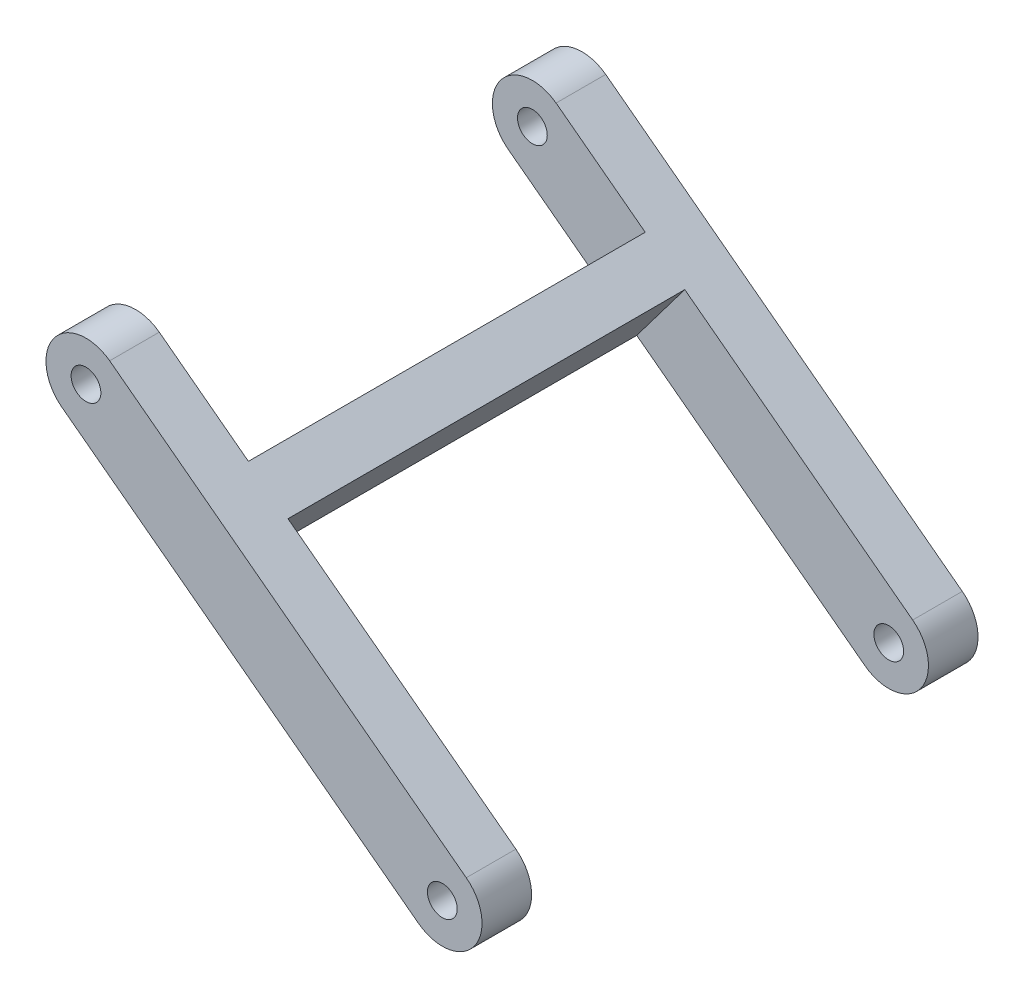
ISO-10303-21;
HEADER;
FILE_DESCRIPTION(('STEP AP214'),'2;1');
FILE_NAME('part.step','',(''),(''),'','','');
FILE_SCHEMA(('AUTOMOTIVE_DESIGN { 1 0 10303 214 1 1 1 1 }'));
ENDSEC;
DATA;
#1=APPLICATION_CONTEXT('core data for automotive mechanical design processes');
#2=APPLICATION_PROTOCOL_DEFINITION('international standard','automotive_design',2000,#1);
#3=PRODUCT_CONTEXT('',#1,'mechanical');
#4=PRODUCT('Part','Part','',(#3));
#5=PRODUCT_RELATED_PRODUCT_CATEGORY('part','',(#4));
#6=PRODUCT_DEFINITION_FORMATION('','',#4);
#7=PRODUCT_DEFINITION_CONTEXT('part definition',#1,'design');
#8=PRODUCT_DEFINITION('design','',#6,#7);
#9=PRODUCT_DEFINITION_SHAPE('','',#8);
#10=(LENGTH_UNIT() NAMED_UNIT(*) SI_UNIT(.MILLI.,.METRE.));
#11=(NAMED_UNIT(*) PLANE_ANGLE_UNIT() SI_UNIT($,.RADIAN.));
#12=(NAMED_UNIT(*) SI_UNIT($,.STERADIAN.) SOLID_ANGLE_UNIT());
#13=UNCERTAINTY_MEASURE_WITH_UNIT(LENGTH_MEASURE(1.E-05),#10,'distance_accuracy_value','');
#14=(GEOMETRIC_REPRESENTATION_CONTEXT(3) GLOBAL_UNCERTAINTY_ASSIGNED_CONTEXT((#13)) GLOBAL_UNIT_ASSIGNED_CONTEXT((#10,
#11,#12)) REPRESENTATION_CONTEXT('',''));
#15=CARTESIAN_POINT('',(0.,0.,0.));
#16=DIRECTION('',(0.,0.,1.));
#17=DIRECTION('',(1.,0.,0.));
#18=AXIS2_PLACEMENT_3D('',#15,#16,#17);
#19=CARTESIAN_POINT('',(-35.92301936865,27.1023371582526,0.));
#20=DIRECTION('',(0.,0.,1.));
#21=DIRECTION('',(1.,0.,0.));
#22=AXIS2_PLACEMENT_3D('',#19,#20,#21);
#23=PLANE('',#22);
#24=CARTESIAN_POINT('',(-35.92301936865,27.1023371582526,0.));
#25=DIRECTION('',(0.,0.,1.));
#26=DIRECTION('',(1.,0.,0.));
#27=AXIS2_PLACEMENT_3D('',#24,#25,#26);
#28=CIRCLE('',#27,1.5);
#29=CARTESIAN_POINT('',(-34.42301936865,27.1023371582526,0.));
#30=VERTEX_POINT('',#29);
#31=EDGE_CURVE('E298',#30,#30,#28,.T.);
#32=ORIENTED_EDGE('',*,*,#31,.T.);
#33=EDGE_LOOP('',(#32));
#34=FACE_BOUND('',#33,.T.);
#35=DIRECTION('',(0.602274159072283,0.79828931930333,0.));
#36=VECTOR('',#35,1.);
#37=CARTESIAN_POINT('',(-24.5499860236757,23.5630361486282,0.));
#38=LINE('',#37,#36);
#39=CARTESIAN_POINT('',(-29.3974472910294,17.1379280858387,0.));
#40=VERTEX_POINT('',#39);
#41=CARTESIAN_POINT('',(-24.5499860236757,23.5630361486282,0.));
#42=VERTEX_POINT('',#41);
#43=EDGE_CURVE('E56',#40,#42,#38,.T.);
#44=ORIENTED_EDGE('',*,*,#43,.F.);
#45=DIRECTION('',(0.7987221887105,-0.601699979442835,0.));
#46=VECTOR('',#45,1.);
#47=CARTESIAN_POINT('',(-2.40679991777134,-3.194888754842,0.));
#48=LINE('',#47,#46);
#49=CARTESIAN_POINT('',(-38.3894947780834,23.9118913794394,0.));
#50=VERTEX_POINT('',#49);
#51=EDGE_CURVE('E277',#50,#40,#48,.T.);
#52=ORIENTED_EDGE('',*,*,#51,.F.);
#53=CARTESIAN_POINT('',(-35.92301936865,27.1023371582526,0.));
#54=DIRECTION('',(0.,0.,1.));
#55=DIRECTION('',(1.,0.,0.));
#56=AXIS2_PLACEMENT_3D('',#53,#54,#55);
#57=CIRCLE('',#56,4.03267221738717);
#58=CARTESIAN_POINT('',(-33.5322823404033,30.3499242124602,0.));
#59=VERTEX_POINT('',#58);
#60=EDGE_CURVE('E310',#59,#50,#57,.T.);
#61=ORIENTED_EDGE('',*,*,#60,.F.);
#62=DIRECTION('',(-0.79785603713415,0.602848027290949,0.));
#63=VECTOR('',#62,1.);
#64=CARTESIAN_POINT('',(2.4113921091638,3.1914241485366,0.));
#65=LINE('',#64,#63);
#66=EDGE_CURVE('E64',#42,#59,#65,.T.);
#67=ORIENTED_EDGE('',*,*,#66,.F.);
#68=EDGE_LOOP('',(#44,#52,#61,#67));
#69=FACE_BOUND('',#68,.T.);
#70=ADVANCED_FACE('F39',(#34,#69),#23,.F.);
#71=CARTESIAN_POINT('',(0.,0.,0.));
#72=DIRECTION('',(0.,0.,1.));
#73=DIRECTION('',(1.,0.,0.));
#74=AXIS2_PLACEMENT_3D('',#71,#72,#73);
#75=CIRCLE('',#74,1.5);
#76=CARTESIAN_POINT('',(1.5,0.,0.));
#77=VERTEX_POINT('',#76);
#78=EDGE_CURVE('E299',#77,#77,#75,.T.);
#79=ORIENTED_EDGE('',*,*,#78,.T.);
#80=EDGE_LOOP('',(#79));
#81=FACE_BOUND('',#80,.T.);
#82=DIRECTION('',(-0.602274159072283,-0.79828931930333,0.));
#83=VECTOR('',#82,1.);
#84=CARTESIAN_POINT('',(-20.5609066030486,20.5489477072224,0.));
#85=LINE('',#84,#83);
#86=CARTESIAN_POINT('',(-20.5609066030486,20.5489477072223,0.));
#87=VERTEX_POINT('',#86);
#88=CARTESIAN_POINT('',(-25.4040373304709,14.1295795947894,0.));
#89=VERTEX_POINT('',#88);
#90=EDGE_CURVE('E152',#87,#89,#85,.T.);
#91=ORIENTED_EDGE('',*,*,#90,.F.);
#92=CARTESIAN_POINT('',(2.4113921091638,3.1914241485366,0.));
#93=VERTEX_POINT('',#92);
#94=EDGE_CURVE('E319',#93,#87,#65,.T.);
#95=ORIENTED_EDGE('',*,*,#94,.F.);
#96=CARTESIAN_POINT('',(0.,0.,0.));
#97=DIRECTION('',(0.,0.,1.));
#98=DIRECTION('',(1.,0.,0.));
#99=AXIS2_PLACEMENT_3D('',#96,#97,#98);
#100=CIRCLE('',#99,4.);
#101=CARTESIAN_POINT('',(-2.40679991777134,-3.194888754842,0.));
#102=VERTEX_POINT('',#101);
#103=EDGE_CURVE('E333',#102,#93,#100,.T.);
#104=ORIENTED_EDGE('',*,*,#103,.F.);
#105=EDGE_CURVE('E254',#89,#102,#48,.T.);
#106=ORIENTED_EDGE('',*,*,#105,.F.);
#107=EDGE_LOOP('',(#91,#95,#104,#106));
#108=FACE_BOUND('',#107,.T.);
#109=ADVANCED_FACE('F358',(#81,#108),#23,.F.);
#110=CARTESIAN_POINT('',(-35.92301936865,27.1023371582526,5.));
#111=DIRECTION('',(0.,0.,1.));
#112=DIRECTION('',(1.,0.,0.));
#113=AXIS2_PLACEMENT_3D('',#110,#111,#112);
#114=PLANE('',#113);
#115=CARTESIAN_POINT('',(-35.92301936865,27.1023371582526,5.));
#116=DIRECTION('',(0.,0.,1.));
#117=DIRECTION('',(1.,0.,0.));
#118=AXIS2_PLACEMENT_3D('',#115,#116,#117);
#119=CIRCLE('',#118,1.5);
#120=CARTESIAN_POINT('',(-34.42301936865,27.1023371582526,5.));
#121=VERTEX_POINT('',#120);
#122=EDGE_CURVE('E306',#121,#121,#119,.T.);
#123=ORIENTED_EDGE('',*,*,#122,.F.);
#124=EDGE_LOOP('',(#123));
#125=FACE_BOUND('',#124,.T.);
#126=CARTESIAN_POINT('',(-35.92301936865,27.1023371582526,5.));
#127=DIRECTION('',(0.,0.,1.));
#128=DIRECTION('',(1.,0.,0.));
#129=AXIS2_PLACEMENT_3D('',#126,#127,#128);
#130=CIRCLE('',#129,4.03267221738717);
#131=CARTESIAN_POINT('',(-33.5322823404033,30.3499242124602,5.));
#132=VERTEX_POINT('',#131);
#133=CARTESIAN_POINT('',(-38.3894947780834,23.9118913794394,5.));
#134=VERTEX_POINT('',#133);
#135=EDGE_CURVE('E314',#132,#134,#130,.T.);
#136=ORIENTED_EDGE('',*,*,#135,.T.);
#137=DIRECTION('',(0.7987221887105,-0.601699979442835,0.));
#138=VECTOR('',#137,1.);
#139=CARTESIAN_POINT('',(-2.40679991777134,-3.194888754842,5.));
#140=LINE('',#139,#138);
#141=CARTESIAN_POINT('',(-2.40679991777134,-3.194888754842,5.));
#142=VERTEX_POINT('',#141);
#143=EDGE_CURVE('E318',#134,#142,#140,.T.);
#144=ORIENTED_EDGE('',*,*,#143,.T.);
#145=CARTESIAN_POINT('',(0.,0.,5.));
#146=DIRECTION('',(0.,0.,1.));
#147=DIRECTION('',(1.,0.,0.));
#148=AXIS2_PLACEMENT_3D('',#145,#146,#147);
#149=CIRCLE('',#148,4.);
#150=CARTESIAN_POINT('',(2.4113921091638,3.1914241485366,5.));
#151=VERTEX_POINT('',#150);
#152=EDGE_CURVE('E322',#142,#151,#149,.T.);
#153=ORIENTED_EDGE('',*,*,#152,.T.);
#154=DIRECTION('',(-0.79785603713415,0.602848027290949,0.));
#155=VECTOR('',#154,1.);
#156=CARTESIAN_POINT('',(2.4113921091638,3.1914241485366,5.));
#157=LINE('',#156,#155);
#158=EDGE_CURVE('E325',#151,#132,#157,.T.);
#159=ORIENTED_EDGE('',*,*,#158,.T.);
#160=EDGE_LOOP('',(#136,#144,#153,#159));
#161=FACE_BOUND('',#160,.T.);
#162=CARTESIAN_POINT('',(0.,0.,5.));
#163=DIRECTION('',(0.,0.,1.));
#164=DIRECTION('',(1.,0.,0.));
#165=AXIS2_PLACEMENT_3D('',#162,#163,#164);
#166=CIRCLE('',#165,1.5);
#167=CARTESIAN_POINT('',(1.5,0.,5.));
#168=VERTEX_POINT('',#167);
#169=EDGE_CURVE('E262',#168,#168,#166,.T.);
#170=ORIENTED_EDGE('',*,*,#169,.F.);
#171=EDGE_LOOP('',(#170));
#172=FACE_BOUND('',#171,.T.);
#173=ADVANCED_FACE('F365',(#125,#161,#172),#114,.T.);
#174=CARTESIAN_POINT('',(-35.92301936865,27.1023371582526,5.));
#175=DIRECTION('',(0.,0.,-1.));
#176=DIRECTION('',(-1.,0.,0.));
#177=AXIS2_PLACEMENT_3D('',#174,#175,#176);
#178=CYLINDRICAL_SURFACE('',#177,4.03267221738717);
#179=ORIENTED_EDGE('',*,*,#60,.T.);
#180=DIRECTION('',(0.,0.,-1.));
#181=VECTOR('',#180,1.);
#182=CARTESIAN_POINT('',(-38.3894947780834,23.9118913794394,5.));
#183=LINE('',#182,#181);
#184=EDGE_CURVE('E11',#134,#50,#183,.T.);
#185=ORIENTED_EDGE('',*,*,#184,.F.);
#186=ORIENTED_EDGE('',*,*,#135,.F.);
#187=DIRECTION('',(0.,0.,-1.));
#188=VECTOR('',#187,1.);
#189=CARTESIAN_POINT('',(-33.5322823404033,30.3499242124602,5.));
#190=LINE('',#189,#188);
#191=EDGE_CURVE('E328',#132,#59,#190,.T.);
#192=ORIENTED_EDGE('',*,*,#191,.T.);
#193=EDGE_LOOP('',(#179,#185,#186,#192));
#194=FACE_BOUND('',#193,.T.);
#195=ADVANCED_FACE('F41',(#194),#178,.T.);
#196=CARTESIAN_POINT('',(-2.40679991777134,-3.194888754842,5.));
#197=DIRECTION('',(0.601699979442835,0.7987221887105,0.));
#198=DIRECTION('',(-0.7987221887105,0.601699979442835,0.));
#199=AXIS2_PLACEMENT_3D('',#196,#197,#198);
#200=PLANE('',#199);
#201=ORIENTED_EDGE('',*,*,#51,.T.);
#202=DIRECTION('',(0.,0.,1.));
#203=VECTOR('',#202,1.);
#204=CARTESIAN_POINT('',(-29.3974472910294,17.1379280858387,-20.));
#205=LINE('',#204,#203);
#206=CARTESIAN_POINT('',(-29.3974472910294,17.1379280858387,-40.));
#207=VERTEX_POINT('',#206);
#208=EDGE_CURVE('E156',#207,#40,#205,.T.);
#209=ORIENTED_EDGE('',*,*,#208,.F.);
#210=DIRECTION('',(0.7987221887105,-0.601699979442835,0.));
#211=VECTOR('',#210,1.);
#212=CARTESIAN_POINT('',(-2.40679991777134,-3.194888754842,-40.));
#213=LINE('',#212,#211);
#214=CARTESIAN_POINT('',(-38.3894947780834,23.9118913794394,-40.));
#215=VERTEX_POINT('',#214);
#216=EDGE_CURVE('E167',#215,#207,#213,.T.);
#217=ORIENTED_EDGE('',*,*,#216,.F.);
#218=DIRECTION('',(0.,0.,1.));
#219=VECTOR('',#218,1.);
#220=CARTESIAN_POINT('',(-38.3894947780834,23.9118913794394,-45.));
#221=LINE('',#220,#219);
#222=CARTESIAN_POINT('',(-38.3894947780834,23.9118913794394,-45.));
#223=VERTEX_POINT('',#222);
#224=EDGE_CURVE('E242',#223,#215,#221,.T.);
#225=ORIENTED_EDGE('',*,*,#224,.F.);
#226=DIRECTION('',(0.7987221887105,-0.601699979442835,0.));
#227=VECTOR('',#226,1.);
#228=CARTESIAN_POINT('',(-2.40679991777134,-3.194888754842,-45.));
#229=LINE('',#228,#227);
#230=CARTESIAN_POINT('',(-2.40679991777134,-3.194888754842,-45.));
#231=VERTEX_POINT('',#230);
#232=EDGE_CURVE('E208',#223,#231,#229,.T.);
#233=ORIENTED_EDGE('',*,*,#232,.T.);
#234=DIRECTION('',(0.,0.,1.));
#235=VECTOR('',#234,1.);
#236=CARTESIAN_POINT('',(-2.40679991777134,-3.194888754842,-45.));
#237=LINE('',#236,#235);
#238=CARTESIAN_POINT('',(-2.40679991777134,-3.194888754842,-40.));
#239=VERTEX_POINT('',#238);
#240=EDGE_CURVE('E162',#231,#239,#237,.T.);
#241=ORIENTED_EDGE('',*,*,#240,.T.);
#242=CARTESIAN_POINT('',(-25.4040373304709,14.1295795947894,-40.));
#243=VERTEX_POINT('',#242);
#244=EDGE_CURVE('E159',#243,#239,#213,.T.);
#245=ORIENTED_EDGE('',*,*,#244,.F.);
#246=DIRECTION('',(0.,0.,1.));
#247=VECTOR('',#246,1.);
#248=CARTESIAN_POINT('',(-25.4040373304709,14.1295795947894,-20.));
#249=LINE('',#248,#247);
#250=EDGE_CURVE('E146',#243,#89,#249,.T.);
#251=ORIENTED_EDGE('',*,*,#250,.T.);
#252=ORIENTED_EDGE('',*,*,#105,.T.);
#253=DIRECTION('',(0.,0.,-1.));
#254=VECTOR('',#253,1.);
#255=CARTESIAN_POINT('',(-2.40679991777134,-3.194888754842,5.));
#256=LINE('',#255,#254);
#257=EDGE_CURVE('E48',#142,#102,#256,.T.);
#258=ORIENTED_EDGE('',*,*,#257,.F.);
#259=ORIENTED_EDGE('',*,*,#143,.F.);
#260=ORIENTED_EDGE('',*,*,#184,.T.);
#261=EDGE_LOOP('',(#201,#209,#217,#225,#233,#241,#245,#251,#252,#258,#259,#260));
#262=FACE_BOUND('',#261,.T.);
#263=ADVANCED_FACE('F160',(#262),#200,.F.);
#264=CARTESIAN_POINT('',(0.,0.,5.));
#265=DIRECTION('',(0.,0.,-1.));
#266=DIRECTION('',(-1.,0.,0.));
#267=AXIS2_PLACEMENT_3D('',#264,#265,#266);
#268=CYLINDRICAL_SURFACE('',#267,4.);
#269=ORIENTED_EDGE('',*,*,#103,.T.);
#270=DIRECTION('',(0.,0.,-1.));
#271=VECTOR('',#270,1.);
#272=CARTESIAN_POINT('',(2.4113921091638,3.1914241485366,5.));
#273=LINE('',#272,#271);
#274=EDGE_CURVE('E345',#151,#93,#273,.T.);
#275=ORIENTED_EDGE('',*,*,#274,.F.);
#276=ORIENTED_EDGE('',*,*,#152,.F.);
#277=ORIENTED_EDGE('',*,*,#257,.T.);
#278=EDGE_LOOP('',(#269,#275,#276,#277));
#279=FACE_BOUND('',#278,.T.);
#280=ADVANCED_FACE('F354',(#279),#268,.T.);
#281=CARTESIAN_POINT('',(2.4113921091638,3.1914241485366,5.));
#282=DIRECTION('',(-0.602848027290949,-0.79785603713415,0.));
#283=DIRECTION('',(0.79785603713415,-0.602848027290949,0.));
#284=AXIS2_PLACEMENT_3D('',#281,#282,#283);
#285=PLANE('',#284);
#286=ORIENTED_EDGE('',*,*,#94,.T.);
#287=DIRECTION('',(0.,0.,1.));
#288=VECTOR('',#287,1.);
#289=CARTESIAN_POINT('',(-20.5609066030486,20.5489477072224,-20.));
#290=LINE('',#289,#288);
#291=CARTESIAN_POINT('',(-20.5609066030486,20.5489477072223,-40.));
#292=VERTEX_POINT('',#291);
#293=EDGE_CURVE('E155',#292,#87,#290,.T.);
#294=ORIENTED_EDGE('',*,*,#293,.F.);
#295=DIRECTION('',(-0.79785603713415,0.602848027290949,0.));
#296=VECTOR('',#295,1.);
#297=CARTESIAN_POINT('',(2.4113921091638,3.1914241485366,-40.));
#298=LINE('',#297,#296);
#299=CARTESIAN_POINT('',(2.4113921091638,3.1914241485366,-40.));
#300=VERTEX_POINT('',#299);
#301=EDGE_CURVE('E173',#300,#292,#298,.T.);
#302=ORIENTED_EDGE('',*,*,#301,.F.);
#303=DIRECTION('',(0.,0.,1.));
#304=VECTOR('',#303,1.);
#305=CARTESIAN_POINT('',(2.4113921091638,3.1914241485366,-45.));
#306=LINE('',#305,#304);
#307=CARTESIAN_POINT('',(2.4113921091638,3.1914241485366,-45.));
#308=VERTEX_POINT('',#307);
#309=EDGE_CURVE('E238',#308,#300,#306,.T.);
#310=ORIENTED_EDGE('',*,*,#309,.F.);
#311=DIRECTION('',(-0.79785603713415,0.602848027290949,0.));
#312=VECTOR('',#311,1.);
#313=CARTESIAN_POINT('',(2.4113921091638,3.1914241485366,-45.));
#314=LINE('',#313,#312);
#315=CARTESIAN_POINT('',(-33.5322823404033,30.3499242124602,-45.));
#316=VERTEX_POINT('',#315);
#317=EDGE_CURVE('E214',#308,#316,#314,.T.);
#318=ORIENTED_EDGE('',*,*,#317,.T.);
#319=DIRECTION('',(0.,0.,1.));
#320=VECTOR('',#319,1.);
#321=CARTESIAN_POINT('',(-33.5322823404033,30.3499242124602,-45.));
#322=LINE('',#321,#320);
#323=CARTESIAN_POINT('',(-33.5322823404033,30.3499242124602,-40.));
#324=VERTEX_POINT('',#323);
#325=EDGE_CURVE('E218',#316,#324,#322,.T.);
#326=ORIENTED_EDGE('',*,*,#325,.T.);
#327=CARTESIAN_POINT('',(-24.5499860236757,23.5630361486282,-40.));
#328=VERTEX_POINT('',#327);
#329=EDGE_CURVE('E228',#328,#324,#298,.T.);
#330=ORIENTED_EDGE('',*,*,#329,.F.);
#331=DIRECTION('',(0.,0.,1.));
#332=VECTOR('',#331,1.);
#333=CARTESIAN_POINT('',(-24.5499860236757,23.5630361486282,-20.));
#334=LINE('',#333,#332);
#335=EDGE_CURVE('E251',#328,#42,#334,.T.);
#336=ORIENTED_EDGE('',*,*,#335,.T.);
#337=ORIENTED_EDGE('',*,*,#66,.T.);
#338=ORIENTED_EDGE('',*,*,#191,.F.);
#339=ORIENTED_EDGE('',*,*,#158,.F.);
#340=ORIENTED_EDGE('',*,*,#274,.T.);
#341=EDGE_LOOP('',(#286,#294,#302,#310,#318,#326,#330,#336,#337,#338,#339,#340));
#342=FACE_BOUND('',#341,.T.);
#343=ADVANCED_FACE('F286',(#342),#285,.F.);
#344=CARTESIAN_POINT('',(-35.92301936865,27.1023371582526,5.));
#345=DIRECTION('',(0.,0.,-1.));
#346=DIRECTION('',(-1.,0.,0.));
#347=AXIS2_PLACEMENT_3D('',#344,#345,#346);
#348=CYLINDRICAL_SURFACE('',#347,1.5);
#349=ORIENTED_EDGE('',*,*,#122,.T.);
#350=EDGE_LOOP('',(#349));
#351=FACE_BOUND('',#350,.T.);
#352=ORIENTED_EDGE('',*,*,#31,.F.);
#353=EDGE_LOOP('',(#352));
#354=FACE_BOUND('',#353,.T.);
#355=ADVANCED_FACE('F380',(#351,#354),#348,.F.);
#356=CARTESIAN_POINT('',(0.,0.,5.));
#357=DIRECTION('',(0.,0.,-1.));
#358=DIRECTION('',(-1.,0.,0.));
#359=AXIS2_PLACEMENT_3D('',#356,#357,#358);
#360=CYLINDRICAL_SURFACE('',#359,1.5);
#361=ORIENTED_EDGE('',*,*,#169,.T.);
#362=EDGE_LOOP('',(#361));
#363=FACE_BOUND('',#362,.T.);
#364=ORIENTED_EDGE('',*,*,#78,.F.);
#365=EDGE_LOOP('',(#364));
#366=FACE_BOUND('',#365,.T.);
#367=ADVANCED_FACE('F396',(#363,#366),#360,.F.);
#368=CARTESIAN_POINT('',(-20.5609066030486,20.5489477072224,-20.));
#369=DIRECTION('',(-0.79828931930333,0.602274159072283,0.));
#370=DIRECTION('',(-0.602274159072283,-0.79828931930333,0.));
#371=AXIS2_PLACEMENT_3D('',#368,#369,#370);
#372=PLANE('',#371);
#373=ORIENTED_EDGE('',*,*,#90,.T.);
#374=ORIENTED_EDGE('',*,*,#250,.F.);
#375=DIRECTION('',(-0.602274159072283,-0.79828931930333,0.));
#376=VECTOR('',#375,1.);
#377=CARTESIAN_POINT('',(-20.5609066030486,20.5489477072224,-40.));
#378=LINE('',#377,#376);
#379=EDGE_CURVE('E151',#292,#243,#378,.T.);
#380=ORIENTED_EDGE('',*,*,#379,.F.);
#381=ORIENTED_EDGE('',*,*,#293,.T.);
#382=EDGE_LOOP('',(#373,#374,#380,#381));
#383=FACE_BOUND('',#382,.T.);
#384=ADVANCED_FACE('F148',(#383),#372,.F.);
#385=CARTESIAN_POINT('',(-24.5499860236757,23.5630361486282,-20.));
#386=DIRECTION('',(0.79828931930333,-0.602274159072283,0.));
#387=DIRECTION('',(0.602274159072283,0.79828931930333,0.));
#388=AXIS2_PLACEMENT_3D('',#385,#386,#387);
#389=PLANE('',#388);
#390=ORIENTED_EDGE('',*,*,#43,.T.);
#391=ORIENTED_EDGE('',*,*,#335,.F.);
#392=DIRECTION('',(0.602274159072283,0.79828931930333,0.));
#393=VECTOR('',#392,1.);
#394=CARTESIAN_POINT('',(-24.5499860236757,23.5630361486282,-40.));
#395=LINE('',#394,#393);
#396=EDGE_CURVE('E175',#207,#328,#395,.T.);
#397=ORIENTED_EDGE('',*,*,#396,.F.);
#398=ORIENTED_EDGE('',*,*,#208,.T.);
#399=EDGE_LOOP('',(#390,#391,#397,#398));
#400=FACE_BOUND('',#399,.T.);
#401=ADVANCED_FACE('F276',(#400),#389,.F.);
#402=CARTESIAN_POINT('',(-35.92301936865,27.1023371582526,-40.));
#403=DIRECTION('',(0.,0.,-1.));
#404=DIRECTION('',(1.,0.,0.));
#405=AXIS2_PLACEMENT_3D('',#402,#403,#404);
#406=PLANE('',#405);
#407=CARTESIAN_POINT('',(-35.92301936865,27.1023371582526,-40.));
#408=DIRECTION('',(0.,0.,1.));
#409=DIRECTION('',(1.,0.,0.));
#410=AXIS2_PLACEMENT_3D('',#407,#408,#409);
#411=CIRCLE('',#410,1.5);
#412=CARTESIAN_POINT('',(-34.42301936865,27.1023371582526,-40.));
#413=VERTEX_POINT('',#412);
#414=EDGE_CURVE('E195',#413,#413,#411,.T.);
#415=ORIENTED_EDGE('',*,*,#414,.F.);
#416=EDGE_LOOP('',(#415));
#417=FACE_BOUND('',#416,.T.);
#418=ORIENTED_EDGE('',*,*,#396,.T.);
#419=ORIENTED_EDGE('',*,*,#329,.T.);
#420=CARTESIAN_POINT('',(-35.92301936865,27.1023371582526,-40.));
#421=DIRECTION('',(0.,0.,1.));
#422=DIRECTION('',(1.,0.,0.));
#423=AXIS2_PLACEMENT_3D('',#420,#421,#422);
#424=CIRCLE('',#423,4.03267221738717);
#425=EDGE_CURVE('E168',#324,#215,#424,.T.);
#426=ORIENTED_EDGE('',*,*,#425,.T.);
#427=ORIENTED_EDGE('',*,*,#216,.T.);
#428=EDGE_LOOP('',(#418,#419,#426,#427));
#429=FACE_BOUND('',#428,.T.);
#430=ADVANCED_FACE('F279',(#417,#429),#406,.F.);
#431=CARTESIAN_POINT('',(0.,0.,-40.));
#432=DIRECTION('',(0.,0.,1.));
#433=DIRECTION('',(1.,0.,0.));
#434=AXIS2_PLACEMENT_3D('',#431,#432,#433);
#435=CIRCLE('',#434,1.5);
#436=CARTESIAN_POINT('',(1.5,0.,-40.));
#437=VERTEX_POINT('',#436);
#438=EDGE_CURVE('E181',#437,#437,#435,.T.);
#439=ORIENTED_EDGE('',*,*,#438,.F.);
#440=EDGE_LOOP('',(#439));
#441=FACE_BOUND('',#440,.T.);
#442=ORIENTED_EDGE('',*,*,#379,.T.);
#443=ORIENTED_EDGE('',*,*,#244,.T.);
#444=CARTESIAN_POINT('',(0.,0.,-40.));
#445=DIRECTION('',(0.,0.,1.));
#446=DIRECTION('',(1.,0.,0.));
#447=AXIS2_PLACEMENT_3D('',#444,#445,#446);
#448=CIRCLE('',#447,4.);
#449=EDGE_CURVE('E223',#239,#300,#448,.T.);
#450=ORIENTED_EDGE('',*,*,#449,.T.);
#451=ORIENTED_EDGE('',*,*,#301,.T.);
#452=EDGE_LOOP('',(#442,#443,#450,#451));
#453=FACE_BOUND('',#452,.T.);
#454=ADVANCED_FACE('F171',(#441,#453),#406,.F.);
#455=CARTESIAN_POINT('',(-35.92301936865,27.1023371582526,-45.));
#456=DIRECTION('',(0.,0.,-1.));
#457=DIRECTION('',(1.,0.,0.));
#458=AXIS2_PLACEMENT_3D('',#455,#456,#457);
#459=PLANE('',#458);
#460=CARTESIAN_POINT('',(-35.92301936865,27.1023371582526,-45.));
#461=DIRECTION('',(0.,0.,1.));
#462=DIRECTION('',(1.,0.,0.));
#463=AXIS2_PLACEMENT_3D('',#460,#461,#462);
#464=CIRCLE('',#463,1.5);
#465=CARTESIAN_POINT('',(-34.42301936865,27.1023371582526,-45.));
#466=VERTEX_POINT('',#465);
#467=EDGE_CURVE('E199',#466,#466,#464,.T.);
#468=ORIENTED_EDGE('',*,*,#467,.T.);
#469=EDGE_LOOP('',(#468));
#470=FACE_BOUND('',#469,.T.);
#471=CARTESIAN_POINT('',(-35.92301936865,27.1023371582526,-45.));
#472=DIRECTION('',(0.,0.,1.));
#473=DIRECTION('',(1.,0.,0.));
#474=AXIS2_PLACEMENT_3D('',#471,#472,#473);
#475=CIRCLE('',#474,4.03267221738717);
#476=EDGE_CURVE('E204',#316,#223,#475,.T.);
#477=ORIENTED_EDGE('',*,*,#476,.F.);
#478=ORIENTED_EDGE('',*,*,#317,.F.);
#479=CARTESIAN_POINT('',(0.,0.,-45.));
#480=DIRECTION('',(0.,0.,1.));
#481=DIRECTION('',(1.,0.,0.));
#482=AXIS2_PLACEMENT_3D('',#479,#480,#481);
#483=CIRCLE('',#482,4.);
#484=EDGE_CURVE('E211',#231,#308,#483,.T.);
#485=ORIENTED_EDGE('',*,*,#484,.F.);
#486=ORIENTED_EDGE('',*,*,#232,.F.);
#487=EDGE_LOOP('',(#477,#478,#485,#486));
#488=FACE_BOUND('',#487,.T.);
#489=CARTESIAN_POINT('',(0.,0.,-45.));
#490=DIRECTION('',(0.,0.,1.));
#491=DIRECTION('',(1.,0.,0.));
#492=AXIS2_PLACEMENT_3D('',#489,#490,#491);
#493=CIRCLE('',#492,1.5);
#494=CARTESIAN_POINT('',(1.5,0.,-45.));
#495=VERTEX_POINT('',#494);
#496=EDGE_CURVE('E191',#495,#495,#493,.T.);
#497=ORIENTED_EDGE('',*,*,#496,.T.);
#498=EDGE_LOOP('',(#497));
#499=FACE_BOUND('',#498,.T.);
#500=ADVANCED_FACE('F290',(#470,#488,#499),#459,.T.);
#501=CARTESIAN_POINT('',(-35.92301936865,27.1023371582526,-45.));
#502=DIRECTION('',(0.,0.,1.));
#503=DIRECTION('',(-1.,0.,0.));
#504=AXIS2_PLACEMENT_3D('',#501,#502,#503);
#505=CYLINDRICAL_SURFACE('',#504,4.03267221738717);
#506=ORIENTED_EDGE('',*,*,#425,.F.);
#507=ORIENTED_EDGE('',*,*,#325,.F.);
#508=ORIENTED_EDGE('',*,*,#476,.T.);
#509=ORIENTED_EDGE('',*,*,#224,.T.);
#510=EDGE_LOOP('',(#506,#507,#508,#509));
#511=FACE_BOUND('',#510,.T.);
#512=ADVANCED_FACE('F281',(#511),#505,.T.);
#513=CARTESIAN_POINT('',(0.,0.,-45.));
#514=DIRECTION('',(0.,0.,1.));
#515=DIRECTION('',(-1.,0.,0.));
#516=AXIS2_PLACEMENT_3D('',#513,#514,#515);
#517=CYLINDRICAL_SURFACE('',#516,4.);
#518=ORIENTED_EDGE('',*,*,#449,.F.);
#519=ORIENTED_EDGE('',*,*,#240,.F.);
#520=ORIENTED_EDGE('',*,*,#484,.T.);
#521=ORIENTED_EDGE('',*,*,#309,.T.);
#522=EDGE_LOOP('',(#518,#519,#520,#521));
#523=FACE_BOUND('',#522,.T.);
#524=ADVANCED_FACE('F293',(#523),#517,.T.);
#525=CARTESIAN_POINT('',(-35.92301936865,27.1023371582526,-45.));
#526=DIRECTION('',(0.,0.,1.));
#527=DIRECTION('',(-1.,0.,0.));
#528=AXIS2_PLACEMENT_3D('',#525,#526,#527);
#529=CYLINDRICAL_SURFACE('',#528,1.5);
#530=ORIENTED_EDGE('',*,*,#467,.F.);
#531=EDGE_LOOP('',(#530));
#532=FACE_BOUND('',#531,.T.);
#533=ORIENTED_EDGE('',*,*,#414,.T.);
#534=EDGE_LOOP('',(#533));
#535=FACE_BOUND('',#534,.T.);
#536=ADVANCED_FACE('F412',(#532,#535),#529,.F.);
#537=CARTESIAN_POINT('',(0.,0.,-45.));
#538=DIRECTION('',(0.,0.,1.));
#539=DIRECTION('',(-1.,0.,0.));
#540=AXIS2_PLACEMENT_3D('',#537,#538,#539);
#541=CYLINDRICAL_SURFACE('',#540,1.5);
#542=ORIENTED_EDGE('',*,*,#496,.F.);
#543=EDGE_LOOP('',(#542));
#544=FACE_BOUND('',#543,.T.);
#545=ORIENTED_EDGE('',*,*,#438,.T.);
#546=EDGE_LOOP('',(#545));
#547=FACE_BOUND('',#546,.T.);
#548=ADVANCED_FACE('F421',(#544,#547),#541,.F.);
#549=CLOSED_SHELL('',(#70,#109,#173,#195,#263,#280,#343,#355,#367,#384,#401,#430,#454,#500,#512,
#524,#536,#548));
#550=MANIFOLD_SOLID_BREP('B2',#549);
#551=ADVANCED_BREP_SHAPE_REPRESENTATION('',(#18,#550),#14);
#552=SHAPE_DEFINITION_REPRESENTATION(#9,#551);
ENDSEC;
END-ISO-10303-21;
